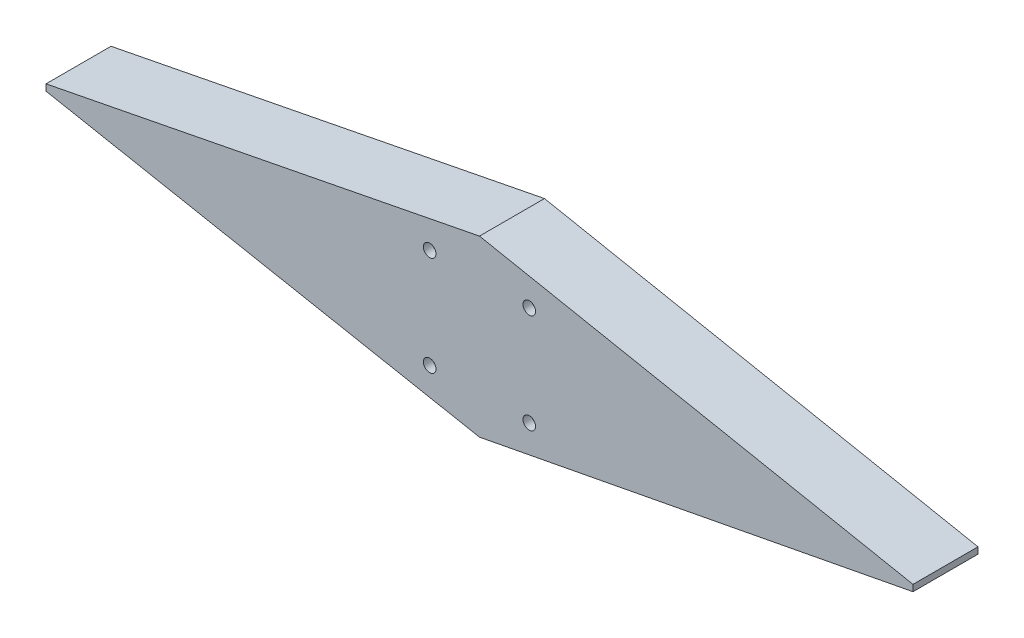
ISO-10303-21;
HEADER;
FILE_DESCRIPTION(('STEP AP214'),'2;1');
FILE_NAME('part.step','',(''),(''),'','','');
FILE_SCHEMA(('AUTOMOTIVE_DESIGN { 1 0 10303 214 1 1 1 1 }'));
ENDSEC;
DATA;
#1=APPLICATION_CONTEXT('core data for automotive mechanical design processes');
#2=APPLICATION_PROTOCOL_DEFINITION('international standard','automotive_design',2000,#1);
#3=PRODUCT_CONTEXT('',#1,'mechanical');
#4=PRODUCT('Part','Part','',(#3));
#5=PRODUCT_RELATED_PRODUCT_CATEGORY('part','',(#4));
#6=PRODUCT_DEFINITION_FORMATION('','',#4);
#7=PRODUCT_DEFINITION_CONTEXT('part definition',#1,'design');
#8=PRODUCT_DEFINITION('design','',#6,#7);
#9=PRODUCT_DEFINITION_SHAPE('','',#8);
#10=(LENGTH_UNIT() NAMED_UNIT(*) SI_UNIT(.MILLI.,.METRE.));
#11=(NAMED_UNIT(*) PLANE_ANGLE_UNIT() SI_UNIT($,.RADIAN.));
#12=(NAMED_UNIT(*) SI_UNIT($,.STERADIAN.) SOLID_ANGLE_UNIT());
#13=UNCERTAINTY_MEASURE_WITH_UNIT(LENGTH_MEASURE(1.E-05),#10,'distance_accuracy_value','');
#14=(GEOMETRIC_REPRESENTATION_CONTEXT(3) GLOBAL_UNCERTAINTY_ASSIGNED_CONTEXT((#13)) GLOBAL_UNIT_ASSIGNED_CONTEXT((#10,
#11,#12)) REPRESENTATION_CONTEXT('',''));
#15=CARTESIAN_POINT('',(0.,0.,0.));
#16=DIRECTION('',(0.,0.,1.));
#17=DIRECTION('',(1.,0.,0.));
#18=AXIS2_PLACEMENT_3D('',#15,#16,#17);
#19=CARTESIAN_POINT('',(-100.,-25.,7.5));
#20=DIRECTION('',(1.,0.,0.));
#21=DIRECTION('',(0.,0.,-1.));
#22=AXIS2_PLACEMENT_3D('',#19,#20,#21);
#23=PLANE('',#22);
#24=DIRECTION('',(0.,-1.,0.));
#25=VECTOR('',#24,1.);
#26=CARTESIAN_POINT('',(-100.,-25.,7.5));
#27=LINE('',#26,#25);
#28=CARTESIAN_POINT('',(-100.000000025684,0.510192390739844,7.5));
#29=VERTEX_POINT('',#28);
#30=CARTESIAN_POINT('',(-100.,-0.965448701696314,7.5));
#31=VERTEX_POINT('',#30);
#32=EDGE_CURVE('E51',#29,#31,#27,.T.);
#33=ORIENTED_EDGE('',*,*,#32,.F.);
#34=DIRECTION('',(0.,0.,-1.));
#35=VECTOR('',#34,1.);
#36=CARTESIAN_POINT('',(-100.000000025684,0.510192390739844,7.5));
#37=LINE('',#36,#35);
#38=CARTESIAN_POINT('',(-100.000000025684,0.510192390739844,-7.5));
#39=VERTEX_POINT('',#38);
#40=EDGE_CURVE('E176',#29,#39,#37,.T.);
#41=ORIENTED_EDGE('',*,*,#40,.T.);
#42=DIRECTION('',(0.,-1.,0.));
#43=VECTOR('',#42,1.);
#44=CARTESIAN_POINT('',(-100.,-25.,-7.5));
#45=LINE('',#44,#43);
#46=CARTESIAN_POINT('',(-100.,-0.965448701696313,-7.5));
#47=VERTEX_POINT('',#46);
#48=EDGE_CURVE('E175',#39,#47,#45,.T.);
#49=ORIENTED_EDGE('',*,*,#48,.T.);
#50=DIRECTION('',(0.,0.,-1.));
#51=VECTOR('',#50,1.);
#52=CARTESIAN_POINT('',(-100.,-0.965448701696314,7.5));
#53=LINE('',#52,#51);
#54=EDGE_CURVE('E184',#31,#47,#53,.T.);
#55=ORIENTED_EDGE('',*,*,#54,.F.);
#56=EDGE_LOOP('',(#33,#41,#49,#55));
#57=FACE_BOUND('',#56,.T.);
#58=ADVANCED_FACE('F43',(#57),#23,.F.);
#59=CARTESIAN_POINT('',(100.,-25.,7.5));
#60=DIRECTION('',(-1.,0.,0.));
#61=DIRECTION('',(0.,0.,1.));
#62=AXIS2_PLACEMENT_3D('',#59,#60,#61);
#63=PLANE('',#62);
#64=DIRECTION('',(0.,1.,0.));
#65=VECTOR('',#64,1.);
#66=CARTESIAN_POINT('',(100.,-25.,-7.5));
#67=LINE('',#66,#65);
#68=CARTESIAN_POINT('',(100.000000029066,-0.965448701696315,-7.5));
#69=VERTEX_POINT('',#68);
#70=CARTESIAN_POINT('',(100.000000025684,0.510192390739844,-7.5));
#71=VERTEX_POINT('',#70);
#72=EDGE_CURVE('E197',#69,#71,#67,.T.);
#73=ORIENTED_EDGE('',*,*,#72,.T.);
#74=DIRECTION('',(0.,0.,-1.));
#75=VECTOR('',#74,1.);
#76=CARTESIAN_POINT('',(100.000000025684,0.510192390739844,7.5));
#77=LINE('',#76,#75);
#78=CARTESIAN_POINT('',(100.000000025684,0.510192390739844,7.5));
#79=VERTEX_POINT('',#78);
#80=EDGE_CURVE('E173',#79,#71,#77,.T.);
#81=ORIENTED_EDGE('',*,*,#80,.F.);
#82=DIRECTION('',(0.,1.,0.));
#83=VECTOR('',#82,1.);
#84=CARTESIAN_POINT('',(100.,-25.,7.5));
#85=LINE('',#84,#83);
#86=CARTESIAN_POINT('',(100.000000029066,-0.965448701696315,7.5));
#87=VERTEX_POINT('',#86);
#88=EDGE_CURVE('E11',#87,#79,#85,.T.);
#89=ORIENTED_EDGE('',*,*,#88,.F.);
#90=DIRECTION('',(0.,0.,-1.));
#91=VECTOR('',#90,1.);
#92=CARTESIAN_POINT('',(100.000000029066,-0.965448701696315,7.5));
#93=LINE('',#92,#91);
#94=EDGE_CURVE('E180',#87,#69,#93,.T.);
#95=ORIENTED_EDGE('',*,*,#94,.T.);
#96=EDGE_LOOP('',(#73,#81,#89,#95));
#97=FACE_BOUND('',#96,.T.);
#98=ADVANCED_FACE('F252',(#97),#63,.F.);
#99=CARTESIAN_POINT('',(0.,0.,7.5));
#100=DIRECTION('',(0.,0.,1.));
#101=DIRECTION('',(1.,0.,0.));
#102=AXIS2_PLACEMENT_3D('',#99,#100,#101);
#103=PLANE('',#102);
#104=CARTESIAN_POINT('',(-11.4904851942813,11.4904851942815,7.5));
#105=DIRECTION('',(0.,0.,1.));
#106=DIRECTION('',(1.,0.,0.));
#107=AXIS2_PLACEMENT_3D('',#104,#105,#106);
#108=CIRCLE('',#107,1.45);
#109=CARTESIAN_POINT('',(-10.0404851942813,11.4904851942815,7.5));
#110=VERTEX_POINT('',#109);
#111=EDGE_CURVE('E221',#110,#110,#108,.T.);
#112=ORIENTED_EDGE('',*,*,#111,.F.);
#113=EDGE_LOOP('',(#112));
#114=FACE_BOUND('',#113,.T.);
#115=CARTESIAN_POINT('',(11.4904851942813,-11.4904851942815,7.5));
#116=DIRECTION('',(0.,0.,1.));
#117=DIRECTION('',(1.,0.,0.));
#118=AXIS2_PLACEMENT_3D('',#115,#116,#117);
#119=CIRCLE('',#118,1.45);
#120=CARTESIAN_POINT('',(12.9404851942813,-11.4904851942815,7.5));
#121=VERTEX_POINT('',#120);
#122=EDGE_CURVE('E211',#121,#121,#119,.T.);
#123=ORIENTED_EDGE('',*,*,#122,.F.);
#124=EDGE_LOOP('',(#123));
#125=FACE_BOUND('',#124,.T.);
#126=CARTESIAN_POINT('',(11.4904851942814,11.4904851942814,7.5));
#127=DIRECTION('',(0.,0.,1.));
#128=DIRECTION('',(1.,0.,0.));
#129=AXIS2_PLACEMENT_3D('',#126,#127,#128);
#130=CIRCLE('',#129,1.45);
#131=CARTESIAN_POINT('',(12.9404851942814,11.4904851942814,7.5));
#132=VERTEX_POINT('',#131);
#133=EDGE_CURVE('E208',#132,#132,#130,.T.);
#134=ORIENTED_EDGE('',*,*,#133,.F.);
#135=EDGE_LOOP('',(#134));
#136=FACE_BOUND('',#135,.T.);
#137=CARTESIAN_POINT('',(-11.4904851942815,-11.4904851942813,7.5));
#138=DIRECTION('',(0.,0.,1.));
#139=DIRECTION('',(1.,0.,0.));
#140=AXIS2_PLACEMENT_3D('',#137,#138,#139);
#141=CIRCLE('',#140,1.45);
#142=CARTESIAN_POINT('',(-10.0404851942815,-11.4904851942813,7.5));
#143=VERTEX_POINT('',#142);
#144=EDGE_CURVE('E205',#143,#143,#141,.T.);
#145=ORIENTED_EDGE('',*,*,#144,.F.);
#146=EDGE_LOOP('',(#145));
#147=FACE_BOUND('',#146,.T.);
#148=DIRECTION('',(-0.981373894017901,0.192107470287187,0.));
#149=VECTOR('',#148,1.);
#150=CARTESIAN_POINT('',(0.,20.0855521499045,7.5));
#151=LINE('',#150,#149);
#152=CARTESIAN_POINT('',(0.,20.0855521499045,7.5));
#153=VERTEX_POINT('',#152);
#154=EDGE_CURVE('E162',#79,#153,#151,.T.);
#155=ORIENTED_EDGE('',*,*,#154,.T.);
#156=DIRECTION('',(-0.981373894017901,-0.192107470287187,0.));
#157=VECTOR('',#156,1.);
#158=CARTESIAN_POINT('',(-100.000000025684,0.510192390739844,7.5));
#159=LINE('',#158,#157);
#160=EDGE_CURVE('E165',#153,#29,#159,.T.);
#161=ORIENTED_EDGE('',*,*,#160,.T.);
#162=ORIENTED_EDGE('',*,*,#32,.T.);
#163=DIRECTION('',(0.982207821794463,-0.18779721724716,0.));
#164=VECTOR('',#163,1.);
#165=CARTESIAN_POINT('',(-100.,-0.965448701696314,7.5));
#166=LINE('',#165,#164);
#167=CARTESIAN_POINT('',(0.,-20.0853552102863,7.5));
#168=VERTEX_POINT('',#167);
#169=EDGE_CURVE('E183',#31,#168,#166,.T.);
#170=ORIENTED_EDGE('',*,*,#169,.T.);
#171=DIRECTION('',(0.982207821804531,0.1877972171945,0.));
#172=VECTOR('',#171,1.);
#173=CARTESIAN_POINT('',(0.,-20.0853552102863,7.5));
#174=LINE('',#173,#172);
#175=EDGE_CURVE('E190',#168,#87,#174,.T.);
#176=ORIENTED_EDGE('',*,*,#175,.T.);
#177=ORIENTED_EDGE('',*,*,#88,.T.);
#178=EDGE_LOOP('',(#155,#161,#162,#170,#176,#177));
#179=FACE_BOUND('',#178,.T.);
#180=ADVANCED_FACE('F235',(#114,#125,#136,#147,#179),#103,.T.);
#181=CARTESIAN_POINT('',(0.,0.,-7.5));
#182=DIRECTION('',(0.,0.,1.));
#183=DIRECTION('',(1.,0.,0.));
#184=AXIS2_PLACEMENT_3D('',#181,#182,#183);
#185=PLANE('',#184);
#186=DIRECTION('',(-0.981373894017901,-0.192107470287187,0.));
#187=VECTOR('',#186,1.);
#188=CARTESIAN_POINT('',(-99.6157850851093,-1.45255539729596,-7.5));
#189=LINE('',#188,#187);
#190=CARTESIAN_POINT('',(0.,18.0475929050221,-7.5));
#191=VERTEX_POINT('',#190);
#192=CARTESIAN_POINT('',(-93.2845866000997,-0.213200517106859,-7.5));
#193=VERTEX_POINT('',#192);
#194=EDGE_CURVE('E153',#191,#193,#189,.T.);
#195=ORIENTED_EDGE('',*,*,#194,.T.);
#196=DIRECTION('',(0.982207821794463,-0.18779721724716,0.));
#197=VECTOR('',#196,1.);
#198=CARTESIAN_POINT('',(-99.6244055655057,0.998966941892612,-7.5));
#199=LINE('',#198,#197);
#200=CARTESIAN_POINT('',(5.45801592298478E-11,-18.0491262619811,-7.5));
#201=VERTEX_POINT('',#200);
#202=EDGE_CURVE('E145',#193,#201,#199,.T.);
#203=ORIENTED_EDGE('',*,*,#202,.T.);
#204=DIRECTION('',(0.982207821804531,0.1877972171945,0.));
#205=VECTOR('',#204,1.);
#206=CARTESIAN_POINT('',(-0.375594434388998,-18.1209395666773,-7.5));
#207=LINE('',#206,#205);
#208=CARTESIAN_POINT('',(93.284586613551,-0.213200519739993,-7.5));
#209=VERTEX_POINT('',#208);
#210=EDGE_CURVE('E139',#201,#209,#207,.T.);
#211=ORIENTED_EDGE('',*,*,#210,.T.);
#212=DIRECTION('',(-0.981373894017901,0.192107470287187,0.));
#213=VECTOR('',#212,1.);
#214=CARTESIAN_POINT('',(-0.384214940574376,18.1228043618687,-7.5));
#215=LINE('',#214,#213);
#216=EDGE_CURVE('E59',#209,#191,#215,.T.);
#217=ORIENTED_EDGE('',*,*,#216,.T.);
#218=EDGE_LOOP('',(#195,#203,#211,#217));
#219=FACE_BOUND('',#218,.T.);
#220=DIRECTION('',(-0.981373894017901,-0.192107470287187,0.));
#221=VECTOR('',#220,1.);
#222=CARTESIAN_POINT('',(-100.000000025684,0.510192390739844,-7.5));
#223=LINE('',#222,#221);
#224=CARTESIAN_POINT('',(0.,20.0855521499045,-7.5));
#225=VERTEX_POINT('',#224);
#226=EDGE_CURVE('E166',#225,#39,#223,.T.);
#227=ORIENTED_EDGE('',*,*,#226,.F.);
#228=DIRECTION('',(-0.981373894017901,0.192107470287187,0.));
#229=VECTOR('',#228,1.);
#230=CARTESIAN_POINT('',(0.,20.0855521499045,-7.5));
#231=LINE('',#230,#229);
#232=EDGE_CURVE('E67',#71,#225,#231,.T.);
#233=ORIENTED_EDGE('',*,*,#232,.F.);
#234=ORIENTED_EDGE('',*,*,#72,.F.);
#235=DIRECTION('',(0.982207821804531,0.1877972171945,0.));
#236=VECTOR('',#235,1.);
#237=CARTESIAN_POINT('',(0.,-20.0853552102863,-7.5));
#238=LINE('',#237,#236);
#239=CARTESIAN_POINT('',(0.,-20.0853552102863,-7.5));
#240=VERTEX_POINT('',#239);
#241=EDGE_CURVE('E171',#240,#69,#238,.T.);
#242=ORIENTED_EDGE('',*,*,#241,.F.);
#243=DIRECTION('',(0.982207821794463,-0.18779721724716,0.));
#244=VECTOR('',#243,1.);
#245=CARTESIAN_POINT('',(-100.,-0.965448701696314,-7.5));
#246=LINE('',#245,#244);
#247=EDGE_CURVE('E187',#47,#240,#246,.T.);
#248=ORIENTED_EDGE('',*,*,#247,.F.);
#249=ORIENTED_EDGE('',*,*,#48,.F.);
#250=EDGE_LOOP('',(#227,#233,#234,#242,#248,#249));
#251=FACE_BOUND('',#250,.T.);
#252=ADVANCED_FACE('F231',(#219,#251),#185,.F.);
#253=CARTESIAN_POINT('',(0.,-20.0853552102863,7.5));
#254=DIRECTION('',(-0.1877972171945,0.982207821804531,0.));
#255=DIRECTION('',(-0.982207821804531,-0.1877972171945,0.));
#256=AXIS2_PLACEMENT_3D('',#253,#254,#255);
#257=PLANE('',#256);
#258=ORIENTED_EDGE('',*,*,#241,.T.);
#259=ORIENTED_EDGE('',*,*,#94,.F.);
#260=ORIENTED_EDGE('',*,*,#175,.F.);
#261=DIRECTION('',(0.,0.,-1.));
#262=VECTOR('',#261,1.);
#263=CARTESIAN_POINT('',(0.,-20.0853552102863,7.5));
#264=LINE('',#263,#262);
#265=EDGE_CURVE('E161',#168,#240,#264,.T.);
#266=ORIENTED_EDGE('',*,*,#265,.T.);
#267=EDGE_LOOP('',(#258,#259,#260,#266));
#268=FACE_BOUND('',#267,.T.);
#269=ADVANCED_FACE('F234',(#268),#257,.F.);
#270=CARTESIAN_POINT('',(-100.,-0.965448701696314,7.5));
#271=DIRECTION('',(0.18779721724716,0.982207821794463,0.));
#272=DIRECTION('',(-0.982207821794463,0.18779721724716,0.));
#273=AXIS2_PLACEMENT_3D('',#270,#271,#272);
#274=PLANE('',#273);
#275=ORIENTED_EDGE('',*,*,#247,.T.);
#276=ORIENTED_EDGE('',*,*,#265,.F.);
#277=ORIENTED_EDGE('',*,*,#169,.F.);
#278=ORIENTED_EDGE('',*,*,#54,.T.);
#279=EDGE_LOOP('',(#275,#276,#277,#278));
#280=FACE_BOUND('',#279,.T.);
#281=ADVANCED_FACE('F257',(#280),#274,.F.);
#282=CARTESIAN_POINT('',(0.,20.0855521499045,7.5));
#283=DIRECTION('',(-0.192107470287187,-0.981373894017901,0.));
#284=DIRECTION('',(0.981373894017901,-0.192107470287187,0.));
#285=AXIS2_PLACEMENT_3D('',#282,#283,#284);
#286=PLANE('',#285);
#287=ORIENTED_EDGE('',*,*,#232,.T.);
#288=DIRECTION('',(0.,0.,-1.));
#289=VECTOR('',#288,1.);
#290=CARTESIAN_POINT('',(0.,20.0855521499045,7.5));
#291=LINE('',#290,#289);
#292=EDGE_CURVE('E169',#153,#225,#291,.T.);
#293=ORIENTED_EDGE('',*,*,#292,.F.);
#294=ORIENTED_EDGE('',*,*,#154,.F.);
#295=ORIENTED_EDGE('',*,*,#80,.T.);
#296=EDGE_LOOP('',(#287,#293,#294,#295));
#297=FACE_BOUND('',#296,.T.);
#298=ADVANCED_FACE('F250',(#297),#286,.F.);
#299=CARTESIAN_POINT('',(-100.000000025684,0.510192390739844,7.5));
#300=DIRECTION('',(0.192107470287187,-0.981373894017901,0.));
#301=DIRECTION('',(0.981373894017901,0.192107470287187,0.));
#302=AXIS2_PLACEMENT_3D('',#299,#300,#301);
#303=PLANE('',#302);
#304=ORIENTED_EDGE('',*,*,#226,.T.);
#305=ORIENTED_EDGE('',*,*,#40,.F.);
#306=ORIENTED_EDGE('',*,*,#160,.F.);
#307=ORIENTED_EDGE('',*,*,#292,.T.);
#308=EDGE_LOOP('',(#304,#305,#306,#307));
#309=FACE_BOUND('',#308,.T.);
#310=ADVANCED_FACE('F242',(#309),#303,.F.);
#311=CARTESIAN_POINT('',(0.,0.,5.5));
#312=DIRECTION('',(0.,0.,1.));
#313=DIRECTION('',(1.,0.,0.));
#314=AXIS2_PLACEMENT_3D('',#311,#312,#313);
#315=PLANE('',#314);
#316=CARTESIAN_POINT('',(-11.4904851942813,11.4904851942815,5.5));
#317=DIRECTION('',(0.,0.,1.));
#318=DIRECTION('',(1.,0.,0.));
#319=AXIS2_PLACEMENT_3D('',#316,#317,#318);
#320=CIRCLE('',#319,1.45);
#321=CARTESIAN_POINT('',(-10.0404851942814,11.4904851942815,5.5));
#322=VERTEX_POINT('',#321);
#323=EDGE_CURVE('E46',#322,#322,#320,.T.);
#324=ORIENTED_EDGE('',*,*,#323,.T.);
#325=EDGE_LOOP('',(#324));
#326=FACE_BOUND('',#325,.T.);
#327=CARTESIAN_POINT('',(11.4904851942813,-11.4904851942815,5.5));
#328=DIRECTION('',(0.,0.,1.));
#329=DIRECTION('',(1.,0.,0.));
#330=AXIS2_PLACEMENT_3D('',#327,#328,#329);
#331=CIRCLE('',#330,1.45);
#332=CARTESIAN_POINT('',(12.9404851942813,-11.4904851942815,5.5));
#333=VERTEX_POINT('',#332);
#334=EDGE_CURVE('E209',#333,#333,#331,.T.);
#335=ORIENTED_EDGE('',*,*,#334,.T.);
#336=EDGE_LOOP('',(#335));
#337=FACE_BOUND('',#336,.T.);
#338=CARTESIAN_POINT('',(11.4904851942814,11.4904851942814,5.5));
#339=DIRECTION('',(0.,0.,1.));
#340=DIRECTION('',(1.,0.,0.));
#341=AXIS2_PLACEMENT_3D('',#338,#339,#340);
#342=CIRCLE('',#341,1.45);
#343=CARTESIAN_POINT('',(12.9404851942814,11.4904851942814,5.5));
#344=VERTEX_POINT('',#343);
#345=EDGE_CURVE('E206',#344,#344,#342,.T.);
#346=ORIENTED_EDGE('',*,*,#345,.T.);
#347=EDGE_LOOP('',(#346));
#348=FACE_BOUND('',#347,.T.);
#349=CARTESIAN_POINT('',(-11.4904851942815,-11.4904851942813,5.5));
#350=DIRECTION('',(0.,0.,1.));
#351=DIRECTION('',(1.,0.,0.));
#352=AXIS2_PLACEMENT_3D('',#349,#350,#351);
#353=CIRCLE('',#352,1.45);
#354=CARTESIAN_POINT('',(-10.0404851942815,-11.4904851942813,5.5));
#355=VERTEX_POINT('',#354);
#356=EDGE_CURVE('E140',#355,#355,#353,.T.);
#357=ORIENTED_EDGE('',*,*,#356,.T.);
#358=EDGE_LOOP('',(#357));
#359=FACE_BOUND('',#358,.T.);
#360=DIRECTION('',(0.982207821804531,0.1877972171945,0.));
#361=VECTOR('',#360,1.);
#362=CARTESIAN_POINT('',(-0.375594434388998,-18.1209395666773,5.5));
#363=LINE('',#362,#361);
#364=CARTESIAN_POINT('',(5.45801592298478E-11,-18.0491262619811,5.5));
#365=VERTEX_POINT('',#364);
#366=CARTESIAN_POINT('',(93.284586613551,-0.213200519739993,5.5));
#367=VERTEX_POINT('',#366);
#368=EDGE_CURVE('E133',#365,#367,#363,.T.);
#369=ORIENTED_EDGE('',*,*,#368,.F.);
#370=DIRECTION('',(0.982207821794463,-0.18779721724716,0.));
#371=VECTOR('',#370,1.);
#372=CARTESIAN_POINT('',(-99.6244055655057,0.998966941892612,5.5));
#373=LINE('',#372,#371);
#374=CARTESIAN_POINT('',(-93.2845866000997,-0.213200517106859,5.5));
#375=VERTEX_POINT('',#374);
#376=EDGE_CURVE('E122',#375,#365,#373,.T.);
#377=ORIENTED_EDGE('',*,*,#376,.F.);
#378=DIRECTION('',(-0.981373894017901,-0.192107470287187,0.));
#379=VECTOR('',#378,1.);
#380=CARTESIAN_POINT('',(-99.6157850851093,-1.45255539729596,5.5));
#381=LINE('',#380,#379);
#382=CARTESIAN_POINT('',(0.,18.0475929050221,5.5));
#383=VERTEX_POINT('',#382);
#384=EDGE_CURVE('E152',#383,#375,#381,.T.);
#385=ORIENTED_EDGE('',*,*,#384,.F.);
#386=DIRECTION('',(-0.981373894017901,0.192107470287187,0.));
#387=VECTOR('',#386,1.);
#388=CARTESIAN_POINT('',(-0.384214940574376,18.1228043618687,5.5));
#389=LINE('',#388,#387);
#390=EDGE_CURVE('E144',#367,#383,#389,.T.);
#391=ORIENTED_EDGE('',*,*,#390,.F.);
#392=EDGE_LOOP('',(#369,#377,#385,#391));
#393=FACE_BOUND('',#392,.T.);
#394=ADVANCED_FACE('F143',(#326,#337,#348,#359,#393),#315,.F.);
#395=CARTESIAN_POINT('',(-0.375594434388998,-18.1209395666773,7.5));
#396=DIRECTION('',(-0.1877972171945,0.982207821804531,0.));
#397=DIRECTION('',(-0.982207821804531,-0.1877972171945,0.));
#398=AXIS2_PLACEMENT_3D('',#395,#396,#397);
#399=PLANE('',#398);
#400=ORIENTED_EDGE('',*,*,#210,.F.);
#401=DIRECTION('',(0.,0.,-1.));
#402=VECTOR('',#401,1.);
#403=CARTESIAN_POINT('',(5.45935909326833E-11,-18.049126261981,7.5));
#404=LINE('',#403,#402);
#405=EDGE_CURVE('E126',#365,#201,#404,.T.);
#406=ORIENTED_EDGE('',*,*,#405,.F.);
#407=ORIENTED_EDGE('',*,*,#368,.T.);
#408=DIRECTION('',(0.,0.,1.));
#409=VECTOR('',#408,1.);
#410=CARTESIAN_POINT('',(93.284586613551,-0.213200519739994,7.5));
#411=LINE('',#410,#409);
#412=EDGE_CURVE('E159',#209,#367,#411,.T.);
#413=ORIENTED_EDGE('',*,*,#412,.F.);
#414=EDGE_LOOP('',(#400,#406,#407,#413));
#415=FACE_BOUND('',#414,.T.);
#416=ADVANCED_FACE('F137',(#415),#399,.T.);
#417=CARTESIAN_POINT('',(-99.6244055655057,0.998966941892612,7.5));
#418=DIRECTION('',(0.18779721724716,0.982207821794463,0.));
#419=DIRECTION('',(-0.982207821794463,0.18779721724716,0.));
#420=AXIS2_PLACEMENT_3D('',#417,#418,#419);
#421=PLANE('',#420);
#422=DIRECTION('',(0.,0.,1.));
#423=VECTOR('',#422,1.);
#424=CARTESIAN_POINT('',(-93.2845866000997,-0.21320051710686,7.5));
#425=LINE('',#424,#423);
#426=EDGE_CURVE('E128',#193,#375,#425,.T.);
#427=ORIENTED_EDGE('',*,*,#426,.T.);
#428=ORIENTED_EDGE('',*,*,#376,.T.);
#429=ORIENTED_EDGE('',*,*,#405,.T.);
#430=ORIENTED_EDGE('',*,*,#202,.F.);
#431=EDGE_LOOP('',(#427,#428,#429,#430));
#432=FACE_BOUND('',#431,.T.);
#433=ADVANCED_FACE('F124',(#432),#421,.T.);
#434=CARTESIAN_POINT('',(-0.384214940574376,18.1228043618687,7.5));
#435=DIRECTION('',(-0.192107470287187,-0.981373894017901,0.));
#436=DIRECTION('',(0.981373894017901,-0.192107470287187,0.));
#437=AXIS2_PLACEMENT_3D('',#434,#435,#436);
#438=PLANE('',#437);
#439=ORIENTED_EDGE('',*,*,#412,.T.);
#440=ORIENTED_EDGE('',*,*,#390,.T.);
#441=DIRECTION('',(0.,0.,-1.));
#442=VECTOR('',#441,1.);
#443=CARTESIAN_POINT('',(0.,18.0475929050221,7.5));
#444=LINE('',#443,#442);
#445=EDGE_CURVE('E150',#383,#191,#444,.T.);
#446=ORIENTED_EDGE('',*,*,#445,.T.);
#447=ORIENTED_EDGE('',*,*,#216,.F.);
#448=EDGE_LOOP('',(#439,#440,#446,#447));
#449=FACE_BOUND('',#448,.T.);
#450=ADVANCED_FACE('F229',(#449),#438,.T.);
#451=CARTESIAN_POINT('',(-99.6157850851093,-1.45255539729596,7.5));
#452=DIRECTION('',(0.192107470287187,-0.981373894017901,0.));
#453=DIRECTION('',(0.981373894017901,0.192107470287187,0.));
#454=AXIS2_PLACEMENT_3D('',#451,#452,#453);
#455=PLANE('',#454);
#456=ORIENTED_EDGE('',*,*,#194,.F.);
#457=ORIENTED_EDGE('',*,*,#445,.F.);
#458=ORIENTED_EDGE('',*,*,#384,.T.);
#459=ORIENTED_EDGE('',*,*,#426,.F.);
#460=EDGE_LOOP('',(#456,#457,#458,#459));
#461=FACE_BOUND('',#460,.T.);
#462=ADVANCED_FACE('F228',(#461),#455,.T.);
#463=CARTESIAN_POINT('',(-11.4904851942815,-11.4904851942813,7.5));
#464=DIRECTION('',(0.,0.,1.));
#465=DIRECTION('',(1.,0.,0.));
#466=AXIS2_PLACEMENT_3D('',#463,#464,#465);
#467=CYLINDRICAL_SURFACE('',#466,1.45);
#468=ORIENTED_EDGE('',*,*,#144,.T.);
#469=EDGE_LOOP('',(#468));
#470=FACE_BOUND('',#469,.T.);
#471=ORIENTED_EDGE('',*,*,#356,.F.);
#472=EDGE_LOOP('',(#471));
#473=FACE_BOUND('',#472,.T.);
#474=ADVANCED_FACE('F287',(#470,#473),#467,.F.);
#475=CARTESIAN_POINT('',(11.4904851942814,11.4904851942814,7.5));
#476=DIRECTION('',(0.,0.,1.));
#477=DIRECTION('',(1.,0.,0.));
#478=AXIS2_PLACEMENT_3D('',#475,#476,#477);
#479=CYLINDRICAL_SURFACE('',#478,1.45);
#480=ORIENTED_EDGE('',*,*,#133,.T.);
#481=EDGE_LOOP('',(#480));
#482=FACE_BOUND('',#481,.T.);
#483=ORIENTED_EDGE('',*,*,#345,.F.);
#484=EDGE_LOOP('',(#483));
#485=FACE_BOUND('',#484,.T.);
#486=ADVANCED_FACE('F290',(#482,#485),#479,.F.);
#487=CARTESIAN_POINT('',(11.4904851942813,-11.4904851942815,7.5));
#488=DIRECTION('',(0.,0.,1.));
#489=DIRECTION('',(1.,0.,0.));
#490=AXIS2_PLACEMENT_3D('',#487,#488,#489);
#491=CYLINDRICAL_SURFACE('',#490,1.45);
#492=ORIENTED_EDGE('',*,*,#122,.T.);
#493=EDGE_LOOP('',(#492));
#494=FACE_BOUND('',#493,.T.);
#495=ORIENTED_EDGE('',*,*,#334,.F.);
#496=EDGE_LOOP('',(#495));
#497=FACE_BOUND('',#496,.T.);
#498=ADVANCED_FACE('F386',(#494,#497),#491,.F.);
#499=CARTESIAN_POINT('',(-11.4904851942813,11.4904851942815,7.5));
#500=DIRECTION('',(0.,0.,1.));
#501=DIRECTION('',(1.,0.,0.));
#502=AXIS2_PLACEMENT_3D('',#499,#500,#501);
#503=CYLINDRICAL_SURFACE('',#502,1.45);
#504=ORIENTED_EDGE('',*,*,#111,.T.);
#505=EDGE_LOOP('',(#504));
#506=FACE_BOUND('',#505,.T.);
#507=ORIENTED_EDGE('',*,*,#323,.F.);
#508=EDGE_LOOP('',(#507));
#509=FACE_BOUND('',#508,.T.);
#510=ADVANCED_FACE('F394',(#506,#509),#503,.F.);
#511=CLOSED_SHELL('',(#58,#98,#180,#252,#269,#281,#298,#310,#394,#416,#433,#450,#462,#474,#486,
#498,#510));
#512=MANIFOLD_SOLID_BREP('B2',#511);
#513=ADVANCED_BREP_SHAPE_REPRESENTATION('',(#18,#512),#14);
#514=SHAPE_DEFINITION_REPRESENTATION(#9,#513);
ENDSEC;
END-ISO-10303-21;
